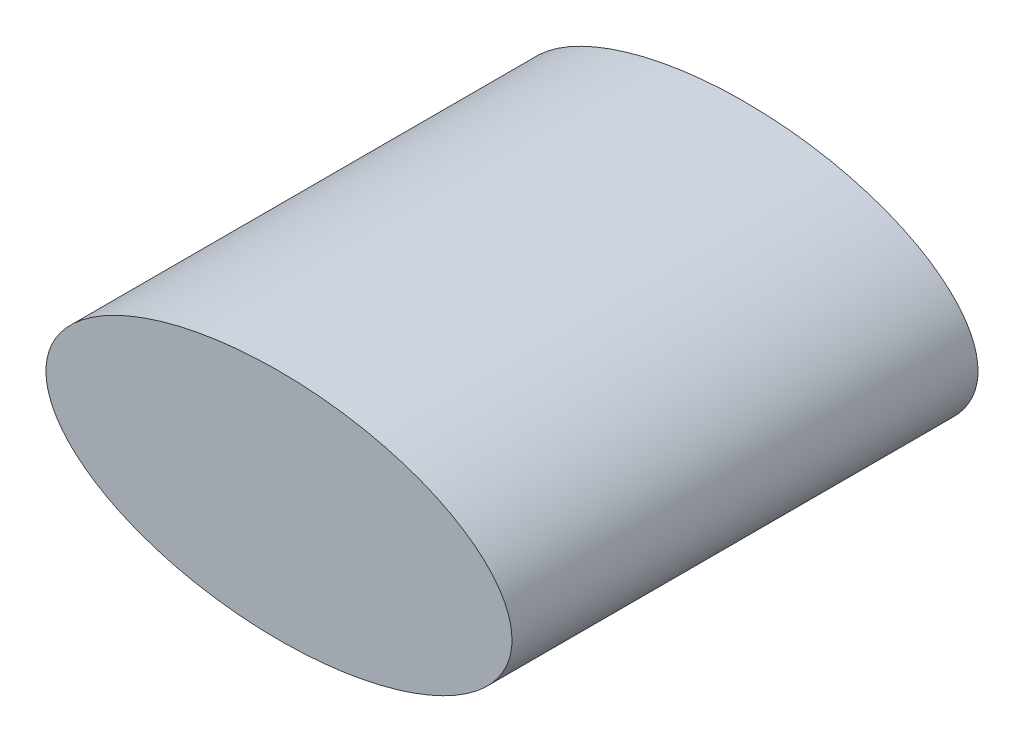
ISO-10303-21;
HEADER;
FILE_DESCRIPTION(('STEP AP214'),'2;1');
FILE_NAME('part.step','',(''),(''),'','','');
FILE_SCHEMA(('AUTOMOTIVE_DESIGN { 1 0 10303 214 1 1 1 1 }'));
ENDSEC;
DATA;
#1=APPLICATION_CONTEXT('core data for automotive mechanical design processes');
#2=APPLICATION_PROTOCOL_DEFINITION('international standard','automotive_design',2000,#1);
#3=PRODUCT_CONTEXT('',#1,'mechanical');
#4=PRODUCT('Part','Part','',(#3));
#5=PRODUCT_RELATED_PRODUCT_CATEGORY('part','',(#4));
#6=PRODUCT_DEFINITION_FORMATION('','',#4);
#7=PRODUCT_DEFINITION_CONTEXT('part definition',#1,'design');
#8=PRODUCT_DEFINITION('design','',#6,#7);
#9=PRODUCT_DEFINITION_SHAPE('','',#8);
#10=(LENGTH_UNIT() NAMED_UNIT(*) SI_UNIT(.MILLI.,.METRE.));
#11=(NAMED_UNIT(*) PLANE_ANGLE_UNIT() SI_UNIT($,.RADIAN.));
#12=(NAMED_UNIT(*) SI_UNIT($,.STERADIAN.) SOLID_ANGLE_UNIT());
#13=UNCERTAINTY_MEASURE_WITH_UNIT(LENGTH_MEASURE(1.E-05),#10,'distance_accuracy_value','');
#14=(GEOMETRIC_REPRESENTATION_CONTEXT(3) GLOBAL_UNCERTAINTY_ASSIGNED_CONTEXT((#13)) GLOBAL_UNIT_ASSIGNED_CONTEXT((#10,
#11,#12)) REPRESENTATION_CONTEXT('',''));
#15=CARTESIAN_POINT('',(0.,0.,0.));
#16=DIRECTION('',(0.,0.,1.));
#17=DIRECTION('',(1.,0.,0.));
#18=AXIS2_PLACEMENT_3D('',#15,#16,#17);
#19=CARTESIAN_POINT('',(0.,0.,20.));
#20=DIRECTION('',(0.,0.,1.));
#21=DIRECTION('',(1.,0.,0.));
#22=AXIS2_PLACEMENT_3D('',#19,#20,#21);
#23=ELLIPSE('',#22,10.,5.);
#24=DIRECTION('',(0.,0.,-1.));
#25=VECTOR('',#24,1.);
#26=SURFACE_OF_LINEAR_EXTRUSION('',#23,#25);
#27=CARTESIAN_POINT('',(10.,0.,20.));
#28=VERTEX_POINT('',#27);
#29=EDGE_CURVE('E10',#28,#28,#23,.T.);
#30=ORIENTED_EDGE('',*,*,#29,.F.);
#31=EDGE_LOOP('',(#30));
#32=FACE_BOUND('',#31,.T.);
#33=CARTESIAN_POINT('',(0.,0.,0.));
#34=DIRECTION('',(0.,0.,1.));
#35=DIRECTION('',(1.,0.,0.));
#36=AXIS2_PLACEMENT_3D('',#33,#34,#35);
#37=ELLIPSE('',#36,10.,5.);
#38=CARTESIAN_POINT('',(10.,0.,0.));
#39=VERTEX_POINT('',#38);
#40=EDGE_CURVE('E45',#39,#39,#37,.T.);
#41=ORIENTED_EDGE('',*,*,#40,.T.);
#42=EDGE_LOOP('',(#41));
#43=FACE_BOUND('',#42,.T.);
#44=ADVANCED_FACE('F41',(#32,#43),#26,.F.);
#45=CARTESIAN_POINT('',(0.,0.,20.));
#46=DIRECTION('',(0.,0.,1.));
#47=DIRECTION('',(1.,0.,0.));
#48=AXIS2_PLACEMENT_3D('',#45,#46,#47);
#49=PLANE('',#48);
#50=ORIENTED_EDGE('',*,*,#29,.T.);
#51=EDGE_LOOP('',(#50));
#52=FACE_BOUND('',#51,.T.);
#53=ADVANCED_FACE('F57',(#52),#49,.T.);
#54=CARTESIAN_POINT('',(0.,0.,0.));
#55=DIRECTION('',(0.,0.,1.));
#56=DIRECTION('',(1.,0.,0.));
#57=AXIS2_PLACEMENT_3D('',#54,#55,#56);
#58=PLANE('',#57);
#59=ORIENTED_EDGE('',*,*,#40,.F.);
#60=EDGE_LOOP('',(#59));
#61=FACE_BOUND('',#60,.T.);
#62=ADVANCED_FACE('F55',(#61),#58,.F.);
#63=CLOSED_SHELL('',(#44,#53,#62));
#64=MANIFOLD_SOLID_BREP('B2',#63);
#65=ADVANCED_BREP_SHAPE_REPRESENTATION('',(#18,#64),#14);
#66=SHAPE_DEFINITION_REPRESENTATION(#9,#65);
ENDSEC;
END-ISO-10303-21;
